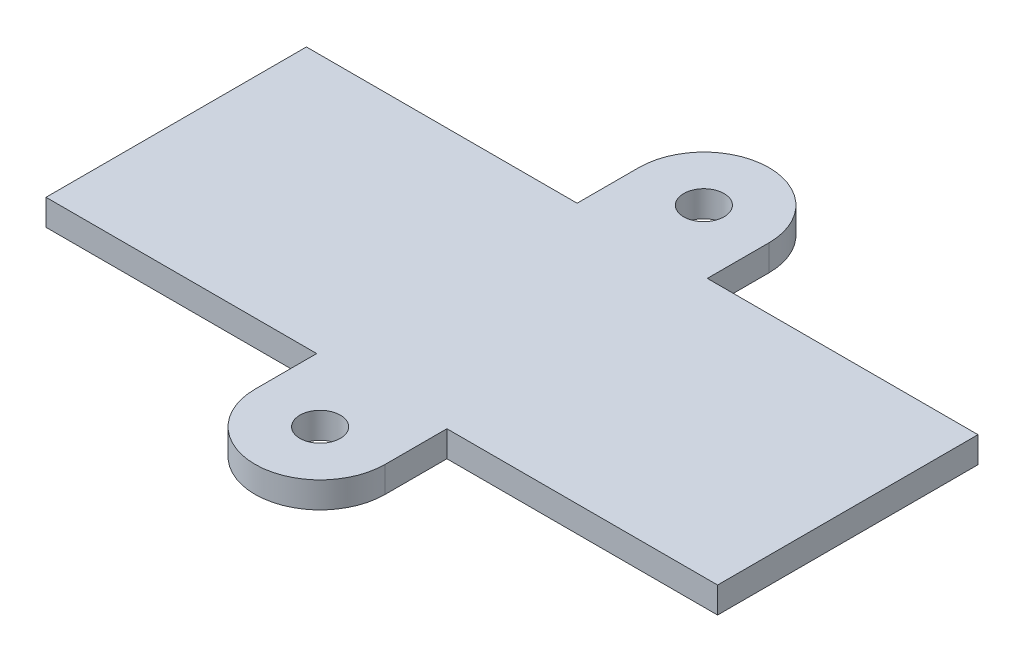
ISO-10303-21;
HEADER;
FILE_DESCRIPTION(('STEP AP214'),'2;1');
FILE_NAME('part.step','',(''),(''),'','','');
FILE_SCHEMA(('AUTOMOTIVE_DESIGN { 1 0 10303 214 1 1 1 1 }'));
ENDSEC;
DATA;
#1=APPLICATION_CONTEXT('core data for automotive mechanical design processes');
#2=APPLICATION_PROTOCOL_DEFINITION('international standard','automotive_design',2000,#1);
#3=PRODUCT_CONTEXT('',#1,'mechanical');
#4=PRODUCT('Part','Part','',(#3));
#5=PRODUCT_RELATED_PRODUCT_CATEGORY('part','',(#4));
#6=PRODUCT_DEFINITION_FORMATION('','',#4);
#7=PRODUCT_DEFINITION_CONTEXT('part definition',#1,'design');
#8=PRODUCT_DEFINITION('design','',#6,#7);
#9=PRODUCT_DEFINITION_SHAPE('','',#8);
#10=(LENGTH_UNIT() NAMED_UNIT(*) SI_UNIT(.MILLI.,.METRE.));
#11=(NAMED_UNIT(*) PLANE_ANGLE_UNIT() SI_UNIT($,.RADIAN.));
#12=(NAMED_UNIT(*) SI_UNIT($,.STERADIAN.) SOLID_ANGLE_UNIT());
#13=UNCERTAINTY_MEASURE_WITH_UNIT(LENGTH_MEASURE(1.E-05),#10,'distance_accuracy_value','');
#14=(GEOMETRIC_REPRESENTATION_CONTEXT(3) GLOBAL_UNCERTAINTY_ASSIGNED_CONTEXT((#13)) GLOBAL_UNIT_ASSIGNED_CONTEXT((#10,
#11,#12)) REPRESENTATION_CONTEXT('',''));
#15=CARTESIAN_POINT('',(0.,0.,0.));
#16=DIRECTION('',(0.,0.,1.));
#17=DIRECTION('',(1.,0.,0.));
#18=AXIS2_PLACEMENT_3D('',#15,#16,#17);
#19=CARTESIAN_POINT('',(-24.5,1.9,9.5));
#20=DIRECTION('',(0.,0.,-1.));
#21=DIRECTION('',(-1.,0.,0.));
#22=AXIS2_PLACEMENT_3D('',#19,#20,#21);
#23=PLANE('',#22);
#24=DIRECTION('',(0.,-1.,0.));
#25=VECTOR('',#24,1.);
#26=CARTESIAN_POINT('',(-4.75,1.9,9.50000000000001));
#27=LINE('',#26,#25);
#28=CARTESIAN_POINT('',(-4.75,1.9,9.50000000000001));
#29=VERTEX_POINT('',#28);
#30=CARTESIAN_POINT('',(-4.75,0.,9.50000000000001));
#31=VERTEX_POINT('',#30);
#32=EDGE_CURVE('E152',#29,#31,#27,.T.);
#33=ORIENTED_EDGE('',*,*,#32,.F.);
#34=DIRECTION('',(1.,0.,0.));
#35=VECTOR('',#34,1.);
#36=CARTESIAN_POINT('',(-24.5,1.9,9.5));
#37=LINE('',#36,#35);
#38=CARTESIAN_POINT('',(-24.5,1.9,9.5));
#39=VERTEX_POINT('',#38);
#40=EDGE_CURVE('E206',#39,#29,#37,.T.);
#41=ORIENTED_EDGE('',*,*,#40,.F.);
#42=DIRECTION('',(0.,-1.,0.));
#43=VECTOR('',#42,1.);
#44=CARTESIAN_POINT('',(-24.5,1.9,9.5));
#45=LINE('',#44,#43);
#46=CARTESIAN_POINT('',(-24.5,0.,9.5));
#47=VERTEX_POINT('',#46);
#48=EDGE_CURVE('E205',#39,#47,#45,.T.);
#49=ORIENTED_EDGE('',*,*,#48,.T.);
#50=DIRECTION('',(1.,0.,0.));
#51=VECTOR('',#50,1.);
#52=CARTESIAN_POINT('',(-24.5,0.,9.5));
#53=LINE('',#52,#51);
#54=EDGE_CURVE('E189',#47,#31,#53,.T.);
#55=ORIENTED_EDGE('',*,*,#54,.T.);
#56=EDGE_LOOP('',(#33,#41,#49,#55));
#57=FACE_BOUND('',#56,.T.);
#58=ADVANCED_FACE('F32',(#57),#23,.F.);
#59=CARTESIAN_POINT('',(-24.5,1.9,-9.5));
#60=DIRECTION('',(0.,0.,1.));
#61=DIRECTION('',(1.,0.,0.));
#62=AXIS2_PLACEMENT_3D('',#59,#60,#61);
#63=PLANE('',#62);
#64=DIRECTION('',(0.,-1.,0.));
#65=VECTOR('',#64,1.);
#66=CARTESIAN_POINT('',(4.75,1.9,-9.50000000000001));
#67=LINE('',#66,#65);
#68=CARTESIAN_POINT('',(4.75,1.9,-9.50000000000001));
#69=VERTEX_POINT('',#68);
#70=CARTESIAN_POINT('',(4.75,0.,-9.50000000000001));
#71=VERTEX_POINT('',#70);
#72=EDGE_CURVE('E171',#69,#71,#67,.T.);
#73=ORIENTED_EDGE('',*,*,#72,.F.);
#74=DIRECTION('',(-1.,0.,0.));
#75=VECTOR('',#74,1.);
#76=CARTESIAN_POINT('',(-24.5,1.9,-9.5));
#77=LINE('',#76,#75);
#78=CARTESIAN_POINT('',(24.5,1.9,-9.5));
#79=VERTEX_POINT('',#78);
#80=EDGE_CURVE('E232',#79,#69,#77,.T.);
#81=ORIENTED_EDGE('',*,*,#80,.F.);
#82=DIRECTION('',(0.,-1.,0.));
#83=VECTOR('',#82,1.);
#84=CARTESIAN_POINT('',(24.5,1.9,-9.5));
#85=LINE('',#84,#83);
#86=CARTESIAN_POINT('',(24.5,0.,-9.5));
#87=VERTEX_POINT('',#86);
#88=EDGE_CURVE('E11',#79,#87,#85,.T.);
#89=ORIENTED_EDGE('',*,*,#88,.T.);
#90=DIRECTION('',(-1.,0.,0.));
#91=VECTOR('',#90,1.);
#92=CARTESIAN_POINT('',(-24.5,0.,-9.5));
#93=LINE('',#92,#91);
#94=EDGE_CURVE('E211',#87,#71,#93,.T.);
#95=ORIENTED_EDGE('',*,*,#94,.T.);
#96=EDGE_LOOP('',(#73,#81,#89,#95));
#97=FACE_BOUND('',#96,.T.);
#98=ADVANCED_FACE('F296',(#97),#63,.F.);
#99=CARTESIAN_POINT('',(24.5,1.9,-9.5));
#100=DIRECTION('',(-1.,0.,0.));
#101=DIRECTION('',(0.,0.,1.));
#102=AXIS2_PLACEMENT_3D('',#99,#100,#101);
#103=PLANE('',#102);
#104=DIRECTION('',(0.,0.,-1.));
#105=VECTOR('',#104,1.);
#106=CARTESIAN_POINT('',(24.5,0.,-9.5));
#107=LINE('',#106,#105);
#108=CARTESIAN_POINT('',(24.5,0.,9.5));
#109=VERTEX_POINT('',#108);
#110=EDGE_CURVE('E218',#109,#87,#107,.T.);
#111=ORIENTED_EDGE('',*,*,#110,.T.);
#112=ORIENTED_EDGE('',*,*,#88,.F.);
#113=DIRECTION('',(0.,0.,-1.));
#114=VECTOR('',#113,1.);
#115=CARTESIAN_POINT('',(24.5,1.9,-9.5));
#116=LINE('',#115,#114);
#117=CARTESIAN_POINT('',(24.5,1.9,9.5));
#118=VERTEX_POINT('',#117);
#119=EDGE_CURVE('E193',#118,#79,#116,.T.);
#120=ORIENTED_EDGE('',*,*,#119,.F.);
#121=DIRECTION('',(0.,-1.,0.));
#122=VECTOR('',#121,1.);
#123=CARTESIAN_POINT('',(24.5,1.9,9.5));
#124=LINE('',#123,#122);
#125=EDGE_CURVE('E201',#118,#109,#124,.T.);
#126=ORIENTED_EDGE('',*,*,#125,.T.);
#127=EDGE_LOOP('',(#111,#112,#120,#126));
#128=FACE_BOUND('',#127,.T.);
#129=ADVANCED_FACE('F34',(#128),#103,.F.);
#130=CARTESIAN_POINT('',(-4.75,1.9,-9.50000000000001));
#131=VERTEX_POINT('',#130);
#132=CARTESIAN_POINT('',(-24.5,1.9,-9.5));
#133=VERTEX_POINT('',#132);
#134=EDGE_CURVE('E236',#131,#133,#77,.T.);
#135=ORIENTED_EDGE('',*,*,#134,.F.);
#136=DIRECTION('',(0.,-1.,0.));
#137=VECTOR('',#136,1.);
#138=CARTESIAN_POINT('',(-4.75,1.9,-9.50000000000001));
#139=LINE('',#138,#137);
#140=CARTESIAN_POINT('',(-4.75,0.,-9.5));
#141=VERTEX_POINT('',#140);
#142=EDGE_CURVE('E180',#131,#141,#139,.T.);
#143=ORIENTED_EDGE('',*,*,#142,.T.);
#144=CARTESIAN_POINT('',(-24.5,0.,-9.5));
#145=VERTEX_POINT('',#144);
#146=EDGE_CURVE('E214',#141,#145,#93,.T.);
#147=ORIENTED_EDGE('',*,*,#146,.T.);
#148=DIRECTION('',(0.,-1.,0.));
#149=VECTOR('',#148,1.);
#150=CARTESIAN_POINT('',(-24.5,1.9,-9.5));
#151=LINE('',#150,#149);
#152=EDGE_CURVE('E41',#133,#145,#151,.T.);
#153=ORIENTED_EDGE('',*,*,#152,.F.);
#154=EDGE_LOOP('',(#135,#143,#147,#153));
#155=FACE_BOUND('',#154,.T.);
#156=ADVANCED_FACE('F252',(#155),#63,.F.);
#157=CARTESIAN_POINT('',(-24.5,1.9,-9.5));
#158=DIRECTION('',(1.,0.,0.));
#159=DIRECTION('',(0.,0.,-1.));
#160=AXIS2_PLACEMENT_3D('',#157,#158,#159);
#161=PLANE('',#160);
#162=DIRECTION('',(0.,0.,1.));
#163=VECTOR('',#162,1.);
#164=CARTESIAN_POINT('',(-24.5,0.,-9.5));
#165=LINE('',#164,#163);
#166=EDGE_CURVE('E199',#145,#47,#165,.T.);
#167=ORIENTED_EDGE('',*,*,#166,.T.);
#168=ORIENTED_EDGE('',*,*,#48,.F.);
#169=DIRECTION('',(0.,0.,1.));
#170=VECTOR('',#169,1.);
#171=CARTESIAN_POINT('',(-24.5,1.9,-9.5));
#172=LINE('',#171,#170);
#173=EDGE_CURVE('E225',#133,#39,#172,.T.);
#174=ORIENTED_EDGE('',*,*,#173,.F.);
#175=ORIENTED_EDGE('',*,*,#152,.T.);
#176=EDGE_LOOP('',(#167,#168,#174,#175));
#177=FACE_BOUND('',#176,.T.);
#178=ADVANCED_FACE('F255',(#177),#161,.F.);
#179=CARTESIAN_POINT('',(4.75,1.9,9.50000000000001));
#180=VERTEX_POINT('',#179);
#181=EDGE_CURVE('E229',#180,#118,#37,.T.);
#182=ORIENTED_EDGE('',*,*,#181,.F.);
#183=DIRECTION('',(0.,-1.,0.));
#184=VECTOR('',#183,1.);
#185=CARTESIAN_POINT('',(4.75,1.9,9.50000000000001));
#186=LINE('',#185,#184);
#187=CARTESIAN_POINT('',(4.75,0.,9.5));
#188=VERTEX_POINT('',#187);
#189=EDGE_CURVE('E128',#180,#188,#186,.T.);
#190=ORIENTED_EDGE('',*,*,#189,.T.);
#191=EDGE_CURVE('E194',#188,#109,#53,.T.);
#192=ORIENTED_EDGE('',*,*,#191,.T.);
#193=ORIENTED_EDGE('',*,*,#125,.F.);
#194=EDGE_LOOP('',(#182,#190,#192,#193));
#195=FACE_BOUND('',#194,.T.);
#196=ADVANCED_FACE('F283',(#195),#23,.F.);
#197=CARTESIAN_POINT('',(24.5,1.9,9.5));
#198=DIRECTION('',(0.,1.,0.));
#199=DIRECTION('',(0.,0.,1.));
#200=AXIS2_PLACEMENT_3D('',#197,#198,#199);
#201=PLANE('',#200);
#202=ORIENTED_EDGE('',*,*,#119,.T.);
#203=ORIENTED_EDGE('',*,*,#80,.T.);
#204=DIRECTION('',(0.,0.,-1.));
#205=VECTOR('',#204,1.);
#206=CARTESIAN_POINT('',(4.75,1.9,-14.));
#207=LINE('',#206,#205);
#208=CARTESIAN_POINT('',(4.75,1.9,-14.));
#209=VERTEX_POINT('',#208);
#210=EDGE_CURVE('E172',#69,#209,#207,.T.);
#211=ORIENTED_EDGE('',*,*,#210,.T.);
#212=CARTESIAN_POINT('',(0.,1.9,-14.));
#213=DIRECTION('',(0.,1.,0.));
#214=DIRECTION('',(0.,0.,-1.));
#215=AXIS2_PLACEMENT_3D('',#212,#213,#214);
#216=CIRCLE('',#215,4.75);
#217=CARTESIAN_POINT('',(-4.75,1.9,-14.));
#218=VERTEX_POINT('',#217);
#219=EDGE_CURVE('E161',#209,#218,#216,.T.);
#220=ORIENTED_EDGE('',*,*,#219,.T.);
#221=DIRECTION('',(0.,0.,1.));
#222=VECTOR('',#221,1.);
#223=CARTESIAN_POINT('',(-4.75,1.9,-14.));
#224=LINE('',#223,#222);
#225=EDGE_CURVE('E164',#218,#131,#224,.T.);
#226=ORIENTED_EDGE('',*,*,#225,.T.);
#227=ORIENTED_EDGE('',*,*,#134,.T.);
#228=ORIENTED_EDGE('',*,*,#173,.T.);
#229=ORIENTED_EDGE('',*,*,#40,.T.);
#230=DIRECTION('',(0.,0.,1.));
#231=VECTOR('',#230,1.);
#232=CARTESIAN_POINT('',(-4.74999999999999,1.9,14.));
#233=LINE('',#232,#231);
#234=CARTESIAN_POINT('',(-4.74999999999999,1.9,14.));
#235=VERTEX_POINT('',#234);
#236=EDGE_CURVE('E131',#29,#235,#233,.T.);
#237=ORIENTED_EDGE('',*,*,#236,.T.);
#238=CARTESIAN_POINT('',(0.,1.9,14.));
#239=DIRECTION('',(0.,1.,0.));
#240=DIRECTION('',(0.,0.,1.));
#241=AXIS2_PLACEMENT_3D('',#238,#239,#240);
#242=CIRCLE('',#241,4.75);
#243=CARTESIAN_POINT('',(4.75,1.9,14.));
#244=VERTEX_POINT('',#243);
#245=EDGE_CURVE('E132',#235,#244,#242,.T.);
#246=ORIENTED_EDGE('',*,*,#245,.T.);
#247=DIRECTION('',(0.,0.,-1.));
#248=VECTOR('',#247,1.);
#249=CARTESIAN_POINT('',(4.75,1.9,14.));
#250=LINE('',#249,#248);
#251=EDGE_CURVE('E122',#244,#180,#250,.T.);
#252=ORIENTED_EDGE('',*,*,#251,.T.);
#253=ORIENTED_EDGE('',*,*,#181,.T.);
#254=EDGE_LOOP('',(#202,#203,#211,#220,#226,#227,#228,#229,#237,#246,#252,#253));
#255=FACE_BOUND('',#254,.T.);
#256=CARTESIAN_POINT('',(0.,1.9,-14.));
#257=DIRECTION('',(0.,1.,0.));
#258=DIRECTION('',(0.,0.,1.));
#259=AXIS2_PLACEMENT_3D('',#256,#257,#258);
#260=CIRCLE('',#259,1.4732);
#261=CARTESIAN_POINT('',(0.,1.9,-15.4732));
#262=VERTEX_POINT('',#261);
#263=EDGE_CURVE('E150',#262,#262,#260,.T.);
#264=ORIENTED_EDGE('',*,*,#263,.F.);
#265=EDGE_LOOP('',(#264));
#266=FACE_BOUND('',#265,.T.);
#267=CARTESIAN_POINT('',(0.,1.9,14.));
#268=DIRECTION('',(0.,1.,0.));
#269=DIRECTION('',(0.,0.,-1.));
#270=AXIS2_PLACEMENT_3D('',#267,#268,#269);
#271=CIRCLE('',#270,1.4732);
#272=CARTESIAN_POINT('',(0.,1.9,12.5268));
#273=VERTEX_POINT('',#272);
#274=EDGE_CURVE('E270',#273,#273,#271,.T.);
#275=ORIENTED_EDGE('',*,*,#274,.F.);
#276=EDGE_LOOP('',(#275));
#277=FACE_BOUND('',#276,.T.);
#278=ADVANCED_FACE('F136',(#255,#266,#277),#201,.T.);
#279=CARTESIAN_POINT('',(24.5,0.,9.5));
#280=DIRECTION('',(0.,1.,0.));
#281=DIRECTION('',(0.,0.,1.));
#282=AXIS2_PLACEMENT_3D('',#279,#280,#281);
#283=PLANE('',#282);
#284=ORIENTED_EDGE('',*,*,#110,.F.);
#285=ORIENTED_EDGE('',*,*,#191,.F.);
#286=DIRECTION('',(0.,0.,-1.));
#287=VECTOR('',#286,1.);
#288=CARTESIAN_POINT('',(4.75,0.,14.));
#289=LINE('',#288,#287);
#290=CARTESIAN_POINT('',(4.75,0.,14.));
#291=VERTEX_POINT('',#290);
#292=EDGE_CURVE('E49',#291,#188,#289,.T.);
#293=ORIENTED_EDGE('',*,*,#292,.F.);
#294=CARTESIAN_POINT('',(0.,0.,14.));
#295=DIRECTION('',(0.,1.,0.));
#296=DIRECTION('',(0.,0.,1.));
#297=AXIS2_PLACEMENT_3D('',#294,#295,#296);
#298=CIRCLE('',#297,4.75);
#299=CARTESIAN_POINT('',(-4.74999999999999,0.,14.));
#300=VERTEX_POINT('',#299);
#301=EDGE_CURVE('E146',#300,#291,#298,.T.);
#302=ORIENTED_EDGE('',*,*,#301,.F.);
#303=DIRECTION('',(0.,0.,1.));
#304=VECTOR('',#303,1.);
#305=CARTESIAN_POINT('',(-4.74999999999999,0.,14.));
#306=LINE('',#305,#304);
#307=EDGE_CURVE('E142',#31,#300,#306,.T.);
#308=ORIENTED_EDGE('',*,*,#307,.F.);
#309=ORIENTED_EDGE('',*,*,#54,.F.);
#310=ORIENTED_EDGE('',*,*,#166,.F.);
#311=ORIENTED_EDGE('',*,*,#146,.F.);
#312=DIRECTION('',(0.,0.,1.));
#313=VECTOR('',#312,1.);
#314=CARTESIAN_POINT('',(-4.75,0.,-14.));
#315=LINE('',#314,#313);
#316=CARTESIAN_POINT('',(-4.75,0.,-14.));
#317=VERTEX_POINT('',#316);
#318=EDGE_CURVE('E57',#317,#141,#315,.T.);
#319=ORIENTED_EDGE('',*,*,#318,.F.);
#320=CARTESIAN_POINT('',(0.,0.,-14.));
#321=DIRECTION('',(0.,1.,0.));
#322=DIRECTION('',(0.,0.,-1.));
#323=AXIS2_PLACEMENT_3D('',#320,#321,#322);
#324=CIRCLE('',#323,4.75);
#325=CARTESIAN_POINT('',(4.75,0.,-14.));
#326=VERTEX_POINT('',#325);
#327=EDGE_CURVE('E159',#326,#317,#324,.T.);
#328=ORIENTED_EDGE('',*,*,#327,.F.);
#329=DIRECTION('',(0.,0.,-1.));
#330=VECTOR('',#329,1.);
#331=CARTESIAN_POINT('',(4.75,0.,-14.));
#332=LINE('',#331,#330);
#333=EDGE_CURVE('E165',#71,#326,#332,.T.);
#334=ORIENTED_EDGE('',*,*,#333,.F.);
#335=ORIENTED_EDGE('',*,*,#94,.F.);
#336=EDGE_LOOP('',(#284,#285,#293,#302,#308,#309,#310,#311,#319,#328,#334,#335));
#337=FACE_BOUND('',#336,.T.);
#338=CARTESIAN_POINT('',(0.,0.,-14.));
#339=DIRECTION('',(0.,1.,0.));
#340=DIRECTION('',(0.,0.,1.));
#341=AXIS2_PLACEMENT_3D('',#338,#339,#340);
#342=CIRCLE('',#341,1.4732);
#343=CARTESIAN_POINT('',(0.,0.,-15.4732));
#344=VERTEX_POINT('',#343);
#345=EDGE_CURVE('E147',#344,#344,#342,.T.);
#346=ORIENTED_EDGE('',*,*,#345,.T.);
#347=EDGE_LOOP('',(#346));
#348=FACE_BOUND('',#347,.T.);
#349=CARTESIAN_POINT('',(0.,0.,14.));
#350=DIRECTION('',(0.,1.,0.));
#351=DIRECTION('',(0.,0.,-1.));
#352=AXIS2_PLACEMENT_3D('',#349,#350,#351);
#353=CIRCLE('',#352,1.4732);
#354=CARTESIAN_POINT('',(0.,0.,12.5268));
#355=VERTEX_POINT('',#354);
#356=EDGE_CURVE('E272',#355,#355,#353,.T.);
#357=ORIENTED_EDGE('',*,*,#356,.T.);
#358=EDGE_LOOP('',(#357));
#359=FACE_BOUND('',#358,.T.);
#360=ADVANCED_FACE('F282',(#337,#348,#359),#283,.F.);
#361=CARTESIAN_POINT('',(0.,1.9,-14.));
#362=DIRECTION('',(0.,-1.,0.));
#363=DIRECTION('',(0.,0.,-1.));
#364=AXIS2_PLACEMENT_3D('',#361,#362,#363);
#365=CYLINDRICAL_SURFACE('',#364,4.75);
#366=ORIENTED_EDGE('',*,*,#327,.T.);
#367=DIRECTION('',(0.,-1.,0.));
#368=VECTOR('',#367,1.);
#369=CARTESIAN_POINT('',(-4.75,1.9,-14.));
#370=LINE('',#369,#368);
#371=EDGE_CURVE('E222',#218,#317,#370,.T.);
#372=ORIENTED_EDGE('',*,*,#371,.F.);
#373=ORIENTED_EDGE('',*,*,#219,.F.);
#374=DIRECTION('',(0.,-1.,0.));
#375=VECTOR('',#374,1.);
#376=CARTESIAN_POINT('',(4.75,1.9,-14.));
#377=LINE('',#376,#375);
#378=EDGE_CURVE('E168',#209,#326,#377,.T.);
#379=ORIENTED_EDGE('',*,*,#378,.T.);
#380=EDGE_LOOP('',(#366,#372,#373,#379));
#381=FACE_BOUND('',#380,.T.);
#382=ADVANCED_FACE('F289',(#381),#365,.T.);
#383=CARTESIAN_POINT('',(-4.75,1.9,-14.));
#384=DIRECTION('',(1.,0.,0.));
#385=DIRECTION('',(0.,0.,-1.));
#386=AXIS2_PLACEMENT_3D('',#383,#384,#385);
#387=PLANE('',#386);
#388=ORIENTED_EDGE('',*,*,#318,.T.);
#389=ORIENTED_EDGE('',*,*,#142,.F.);
#390=ORIENTED_EDGE('',*,*,#225,.F.);
#391=ORIENTED_EDGE('',*,*,#371,.T.);
#392=EDGE_LOOP('',(#388,#389,#390,#391));
#393=FACE_BOUND('',#392,.T.);
#394=ADVANCED_FACE('F251',(#393),#387,.F.);
#395=CARTESIAN_POINT('',(4.75,1.9,-14.));
#396=DIRECTION('',(-1.,0.,0.));
#397=DIRECTION('',(0.,0.,1.));
#398=AXIS2_PLACEMENT_3D('',#395,#396,#397);
#399=PLANE('',#398);
#400=ORIENTED_EDGE('',*,*,#333,.T.);
#401=ORIENTED_EDGE('',*,*,#378,.F.);
#402=ORIENTED_EDGE('',*,*,#210,.F.);
#403=ORIENTED_EDGE('',*,*,#72,.T.);
#404=EDGE_LOOP('',(#400,#401,#402,#403));
#405=FACE_BOUND('',#404,.T.);
#406=ADVANCED_FACE('F319',(#405),#399,.F.);
#407=CARTESIAN_POINT('',(0.,1.9,-14.));
#408=DIRECTION('',(0.,-1.,0.));
#409=DIRECTION('',(0.,0.,-1.));
#410=AXIS2_PLACEMENT_3D('',#407,#408,#409);
#411=CYLINDRICAL_SURFACE('',#410,1.4732);
#412=CARTESIAN_POINT('',(0.,1.9,-15.4732));
#413=CARTESIAN_POINT('',(0.,1.88020833333333,-15.4732));
#414=CARTESIAN_POINT('',(0.,1.86041666666667,-15.4732));
#415=CARTESIAN_POINT('',(0.,1.82083333333333,-15.4732));
#416=CARTESIAN_POINT('',(0.,1.80104166666667,-15.4732));
#417=CARTESIAN_POINT('',(0.,1.76145833333333,-15.4732));
#418=CARTESIAN_POINT('',(0.,1.74166666666667,-15.4732));
#419=CARTESIAN_POINT('',(0.,1.70208333333333,-15.4732));
#420=CARTESIAN_POINT('',(0.,1.68229166666667,-15.4732));
#421=CARTESIAN_POINT('',(0.,1.64270833333333,-15.4732));
#422=CARTESIAN_POINT('',(0.,1.62291666666667,-15.4732));
#423=CARTESIAN_POINT('',(0.,1.58333333333333,-15.4732));
#424=CARTESIAN_POINT('',(0.,1.56354166666667,-15.4732));
#425=CARTESIAN_POINT('',(0.,1.52395833333333,-15.4732));
#426=CARTESIAN_POINT('',(0.,1.50416666666667,-15.4732));
#427=CARTESIAN_POINT('',(0.,1.46458333333333,-15.4732));
#428=CARTESIAN_POINT('',(0.,1.44479166666667,-15.4732));
#429=CARTESIAN_POINT('',(0.,1.40520833333333,-15.4732));
#430=CARTESIAN_POINT('',(0.,1.38541666666667,-15.4732));
#431=CARTESIAN_POINT('',(0.,1.34583333333333,-15.4732));
#432=CARTESIAN_POINT('',(0.,1.32604166666667,-15.4732));
#433=CARTESIAN_POINT('',(0.,1.28645833333333,-15.4732));
#434=CARTESIAN_POINT('',(0.,1.26666666666667,-15.4732));
#435=CARTESIAN_POINT('',(0.,1.22708333333333,-15.4732));
#436=CARTESIAN_POINT('',(0.,1.20729166666667,-15.4732));
#437=CARTESIAN_POINT('',(0.,1.16770833333333,-15.4732));
#438=CARTESIAN_POINT('',(0.,1.14791666666667,-15.4732));
#439=CARTESIAN_POINT('',(0.,1.10833333333333,-15.4732));
#440=CARTESIAN_POINT('',(0.,1.08854166666667,-15.4732));
#441=CARTESIAN_POINT('',(0.,1.04895833333333,-15.4732));
#442=CARTESIAN_POINT('',(0.,1.02916666666667,-15.4732));
#443=CARTESIAN_POINT('',(0.,0.989583333333333,-15.4732));
#444=CARTESIAN_POINT('',(0.,0.969791666666667,-15.4732));
#445=CARTESIAN_POINT('',(0.,0.930208333333333,-15.4732));
#446=CARTESIAN_POINT('',(0.,0.910416666666667,-15.4732));
#447=CARTESIAN_POINT('',(0.,0.870833333333333,-15.4732));
#448=CARTESIAN_POINT('',(0.,0.851041666666667,-15.4732));
#449=CARTESIAN_POINT('',(0.,0.811458333333333,-15.4732));
#450=CARTESIAN_POINT('',(0.,0.791666666666667,-15.4732));
#451=CARTESIAN_POINT('',(0.,0.752083333333333,-15.4732));
#452=CARTESIAN_POINT('',(0.,0.732291666666667,-15.4732));
#453=CARTESIAN_POINT('',(0.,0.692708333333333,-15.4732));
#454=CARTESIAN_POINT('',(0.,0.672916666666667,-15.4732));
#455=CARTESIAN_POINT('',(0.,0.633333333333333,-15.4732));
#456=CARTESIAN_POINT('',(0.,0.613541666666667,-15.4732));
#457=CARTESIAN_POINT('',(0.,0.573958333333333,-15.4732));
#458=CARTESIAN_POINT('',(0.,0.554166666666667,-15.4732));
#459=CARTESIAN_POINT('',(0.,0.514583333333333,-15.4732));
#460=CARTESIAN_POINT('',(0.,0.494791666666667,-15.4732));
#461=CARTESIAN_POINT('',(0.,0.455208333333333,-15.4732));
#462=CARTESIAN_POINT('',(0.,0.435416666666667,-15.4732));
#463=CARTESIAN_POINT('',(0.,0.395833333333333,-15.4732));
#464=CARTESIAN_POINT('',(0.,0.376041666666667,-15.4732));
#465=CARTESIAN_POINT('',(0.,0.336458333333333,-15.4732));
#466=CARTESIAN_POINT('',(0.,0.316666666666667,-15.4732));
#467=CARTESIAN_POINT('',(0.,0.277083333333333,-15.4732));
#468=CARTESIAN_POINT('',(0.,0.257291666666667,-15.4732));
#469=CARTESIAN_POINT('',(0.,0.217708333333333,-15.4732));
#470=CARTESIAN_POINT('',(0.,0.197916666666667,-15.4732));
#471=CARTESIAN_POINT('',(0.,0.158333333333333,-15.4732));
#472=CARTESIAN_POINT('',(0.,0.138541666666667,-15.4732));
#473=CARTESIAN_POINT('',(0.,0.0989583333333333,-15.4732));
#474=CARTESIAN_POINT('',(0.,0.0791666666666666,-15.4732));
#475=CARTESIAN_POINT('',(0.,0.0395833333333333,-15.4732));
#476=CARTESIAN_POINT('',(0.,0.0197916666666666,-15.4732));
#477=CARTESIAN_POINT('',(0.,0.,-15.4732));
#478=B_SPLINE_CURVE_WITH_KNOTS('',3,(#412,#413,#414,#415,#416,#417,#418,#419,#420,#421,#422,
#423,#424,#425,#426,#427,#428,#429,#430,#431,#432,#433,#434,#435,#436,#437,#438,#439,#440,#441,
#442,#443,#444,#445,#446,#447,#448,#449,#450,#451,#452,#453,#454,#455,#456,#457,#458,#459,#460,
#461,#462,#463,#464,#465,#466,#467,#468,#469,#470,#471,#472,#473,#474,#475,#476,#477),
.UNSPECIFIED.,.F.,.F.,(4,2,2,2,2,2,2,2,2,2,2,2,2,2,2,2,2,2,2,2,2,2,2,2,2,2,2,2,2,2,2,2,4),(0.,
0.059375,0.11875,0.178125,0.2375,0.296875,0.35625,0.415625,0.475,0.534375,0.59375,0.653125,
0.7125,0.771875,0.83125,0.890625,0.95,1.009375,1.06875,1.128125,1.1875,1.246875,1.30625,
1.365625,1.425,1.484375,1.54375,1.603125,1.6625,1.721875,1.78125,1.840625,1.9),.UNSPECIFIED.);
#479=EDGE_CURVE('BSEAM338',#262,#344,#478,.T.);
#480=ORIENTED_EDGE('',*,*,#263,.T.);
#481=ORIENTED_EDGE('',*,*,#345,.F.);
#482=ORIENTED_EDGE('',*,*,#479,.T.);
#483=ORIENTED_EDGE('',*,*,#479,.F.);
#484=EDGE_LOOP('',(#480,#482,#481,#483));
#485=FACE_BOUND('',#484,.T.);
#486=ADVANCED_FACE('F338',(#485),#411,.F.);
#487=CARTESIAN_POINT('',(0.,1.9,14.));
#488=DIRECTION('',(0.,-1.,0.));
#489=DIRECTION('',(0.,0.,-1.));
#490=AXIS2_PLACEMENT_3D('',#487,#488,#489);
#491=CYLINDRICAL_SURFACE('',#490,4.75);
#492=ORIENTED_EDGE('',*,*,#301,.T.);
#493=DIRECTION('',(0.,-1.,0.));
#494=VECTOR('',#493,1.);
#495=CARTESIAN_POINT('',(4.75,1.9,14.));
#496=LINE('',#495,#494);
#497=EDGE_CURVE('E126',#244,#291,#496,.T.);
#498=ORIENTED_EDGE('',*,*,#497,.F.);
#499=ORIENTED_EDGE('',*,*,#245,.F.);
#500=DIRECTION('',(0.,-1.,0.));
#501=VECTOR('',#500,1.);
#502=CARTESIAN_POINT('',(-4.74999999999999,1.9,14.));
#503=LINE('',#502,#501);
#504=EDGE_CURVE('E261',#235,#300,#503,.T.);
#505=ORIENTED_EDGE('',*,*,#504,.T.);
#506=EDGE_LOOP('',(#492,#498,#499,#505));
#507=FACE_BOUND('',#506,.T.);
#508=ADVANCED_FACE('F144',(#507),#491,.T.);
#509=CARTESIAN_POINT('',(4.75,1.9,14.));
#510=DIRECTION('',(-1.,0.,0.));
#511=DIRECTION('',(0.,0.,1.));
#512=AXIS2_PLACEMENT_3D('',#509,#510,#511);
#513=PLANE('',#512);
#514=ORIENTED_EDGE('',*,*,#292,.T.);
#515=ORIENTED_EDGE('',*,*,#189,.F.);
#516=ORIENTED_EDGE('',*,*,#251,.F.);
#517=ORIENTED_EDGE('',*,*,#497,.T.);
#518=EDGE_LOOP('',(#514,#515,#516,#517));
#519=FACE_BOUND('',#518,.T.);
#520=ADVANCED_FACE('F124',(#519),#513,.F.);
#521=CARTESIAN_POINT('',(-4.74999999999999,1.9,14.));
#522=DIRECTION('',(1.,0.,0.));
#523=DIRECTION('',(0.,0.,-1.));
#524=AXIS2_PLACEMENT_3D('',#521,#522,#523);
#525=PLANE('',#524);
#526=ORIENTED_EDGE('',*,*,#307,.T.);
#527=ORIENTED_EDGE('',*,*,#504,.F.);
#528=ORIENTED_EDGE('',*,*,#236,.F.);
#529=ORIENTED_EDGE('',*,*,#32,.T.);
#530=EDGE_LOOP('',(#526,#527,#528,#529));
#531=FACE_BOUND('',#530,.T.);
#532=ADVANCED_FACE('F326',(#531),#525,.F.);
#533=CARTESIAN_POINT('',(0.,1.9,14.));
#534=DIRECTION('',(0.,-1.,0.));
#535=DIRECTION('',(0.,0.,-1.));
#536=AXIS2_PLACEMENT_3D('',#533,#534,#535);
#537=CYLINDRICAL_SURFACE('',#536,1.4732);
#538=CARTESIAN_POINT('',(0.,1.9,12.5268));
#539=CARTESIAN_POINT('',(0.,1.88020833333333,12.5268));
#540=CARTESIAN_POINT('',(0.,1.86041666666667,12.5268));
#541=CARTESIAN_POINT('',(0.,1.82083333333333,12.5268));
#542=CARTESIAN_POINT('',(0.,1.80104166666667,12.5268));
#543=CARTESIAN_POINT('',(0.,1.76145833333333,12.5268));
#544=CARTESIAN_POINT('',(0.,1.74166666666667,12.5268));
#545=CARTESIAN_POINT('',(0.,1.70208333333333,12.5268));
#546=CARTESIAN_POINT('',(0.,1.68229166666667,12.5268));
#547=CARTESIAN_POINT('',(0.,1.64270833333333,12.5268));
#548=CARTESIAN_POINT('',(0.,1.62291666666667,12.5268));
#549=CARTESIAN_POINT('',(0.,1.58333333333333,12.5268));
#550=CARTESIAN_POINT('',(0.,1.56354166666667,12.5268));
#551=CARTESIAN_POINT('',(0.,1.52395833333333,12.5268));
#552=CARTESIAN_POINT('',(0.,1.50416666666667,12.5268));
#553=CARTESIAN_POINT('',(0.,1.46458333333333,12.5268));
#554=CARTESIAN_POINT('',(0.,1.44479166666667,12.5268));
#555=CARTESIAN_POINT('',(0.,1.40520833333333,12.5268));
#556=CARTESIAN_POINT('',(0.,1.38541666666667,12.5268));
#557=CARTESIAN_POINT('',(0.,1.34583333333333,12.5268));
#558=CARTESIAN_POINT('',(0.,1.32604166666667,12.5268));
#559=CARTESIAN_POINT('',(0.,1.28645833333333,12.5268));
#560=CARTESIAN_POINT('',(0.,1.26666666666667,12.5268));
#561=CARTESIAN_POINT('',(0.,1.22708333333333,12.5268));
#562=CARTESIAN_POINT('',(0.,1.20729166666667,12.5268));
#563=CARTESIAN_POINT('',(0.,1.16770833333333,12.5268));
#564=CARTESIAN_POINT('',(0.,1.14791666666667,12.5268));
#565=CARTESIAN_POINT('',(0.,1.10833333333333,12.5268));
#566=CARTESIAN_POINT('',(0.,1.08854166666667,12.5268));
#567=CARTESIAN_POINT('',(0.,1.04895833333333,12.5268));
#568=CARTESIAN_POINT('',(0.,1.02916666666667,12.5268));
#569=CARTESIAN_POINT('',(0.,0.989583333333333,12.5268));
#570=CARTESIAN_POINT('',(0.,0.969791666666667,12.5268));
#571=CARTESIAN_POINT('',(0.,0.930208333333333,12.5268));
#572=CARTESIAN_POINT('',(0.,0.910416666666667,12.5268));
#573=CARTESIAN_POINT('',(0.,0.870833333333333,12.5268));
#574=CARTESIAN_POINT('',(0.,0.851041666666667,12.5268));
#575=CARTESIAN_POINT('',(0.,0.811458333333333,12.5268));
#576=CARTESIAN_POINT('',(0.,0.791666666666667,12.5268));
#577=CARTESIAN_POINT('',(0.,0.752083333333333,12.5268));
#578=CARTESIAN_POINT('',(0.,0.732291666666667,12.5268));
#579=CARTESIAN_POINT('',(0.,0.692708333333333,12.5268));
#580=CARTESIAN_POINT('',(0.,0.672916666666667,12.5268));
#581=CARTESIAN_POINT('',(0.,0.633333333333333,12.5268));
#582=CARTESIAN_POINT('',(0.,0.613541666666667,12.5268));
#583=CARTESIAN_POINT('',(0.,0.573958333333333,12.5268));
#584=CARTESIAN_POINT('',(0.,0.554166666666667,12.5268));
#585=CARTESIAN_POINT('',(0.,0.514583333333333,12.5268));
#586=CARTESIAN_POINT('',(0.,0.494791666666667,12.5268));
#587=CARTESIAN_POINT('',(0.,0.455208333333333,12.5268));
#588=CARTESIAN_POINT('',(0.,0.435416666666667,12.5268));
#589=CARTESIAN_POINT('',(0.,0.395833333333333,12.5268));
#590=CARTESIAN_POINT('',(0.,0.376041666666667,12.5268));
#591=CARTESIAN_POINT('',(0.,0.336458333333333,12.5268));
#592=CARTESIAN_POINT('',(0.,0.316666666666667,12.5268));
#593=CARTESIAN_POINT('',(0.,0.277083333333333,12.5268));
#594=CARTESIAN_POINT('',(0.,0.257291666666667,12.5268));
#595=CARTESIAN_POINT('',(0.,0.217708333333333,12.5268));
#596=CARTESIAN_POINT('',(0.,0.197916666666667,12.5268));
#597=CARTESIAN_POINT('',(0.,0.158333333333333,12.5268));
#598=CARTESIAN_POINT('',(0.,0.138541666666667,12.5268));
#599=CARTESIAN_POINT('',(0.,0.0989583333333333,12.5268));
#600=CARTESIAN_POINT('',(0.,0.0791666666666666,12.5268));
#601=CARTESIAN_POINT('',(0.,0.0395833333333333,12.5268));
#602=CARTESIAN_POINT('',(0.,0.0197916666666666,12.5268));
#603=CARTESIAN_POINT('',(0.,0.,12.5268));
#604=B_SPLINE_CURVE_WITH_KNOTS('',3,(#538,#539,#540,#541,#542,#543,#544,#545,#546,#547,#548,
#549,#550,#551,#552,#553,#554,#555,#556,#557,#558,#559,#560,#561,#562,#563,#564,#565,#566,#567,
#568,#569,#570,#571,#572,#573,#574,#575,#576,#577,#578,#579,#580,#581,#582,#583,#584,#585,#586,
#587,#588,#589,#590,#591,#592,#593,#594,#595,#596,#597,#598,#599,#600,#601,#602,#603),
.UNSPECIFIED.,.F.,.F.,(4,2,2,2,2,2,2,2,2,2,2,2,2,2,2,2,2,2,2,2,2,2,2,2,2,2,2,2,2,2,2,2,4),(0.,
0.059375,0.11875,0.178125,0.2375,0.296875,0.35625,0.415625,0.475,0.534375,0.59375,0.653125,
0.7125,0.771875,0.83125,0.890625,0.95,1.009375,1.06875,1.128125,1.1875,1.246875,1.30625,
1.365625,1.425,1.484375,1.54375,1.603125,1.6625,1.721875,1.78125,1.840625,1.9),.UNSPECIFIED.);
#605=EDGE_CURVE('BSEAM278',#273,#355,#604,.T.);
#606=ORIENTED_EDGE('',*,*,#274,.T.);
#607=ORIENTED_EDGE('',*,*,#356,.F.);
#608=ORIENTED_EDGE('',*,*,#605,.T.);
#609=ORIENTED_EDGE('',*,*,#605,.F.);
#610=EDGE_LOOP('',(#606,#608,#607,#609));
#611=FACE_BOUND('',#610,.T.);
#612=ADVANCED_FACE('F278',(#611),#537,.F.);
#613=CLOSED_SHELL('',(#58,#98,#129,#156,#178,#196,#278,#360,#382,#394,#406,#486,#508,#520,#532,#612));
#614=MANIFOLD_SOLID_BREP('B2',#613);
#615=ADVANCED_BREP_SHAPE_REPRESENTATION('',(#18,#614),#14);
#616=SHAPE_DEFINITION_REPRESENTATION(#9,#615);
ENDSEC;
END-ISO-10303-21;
